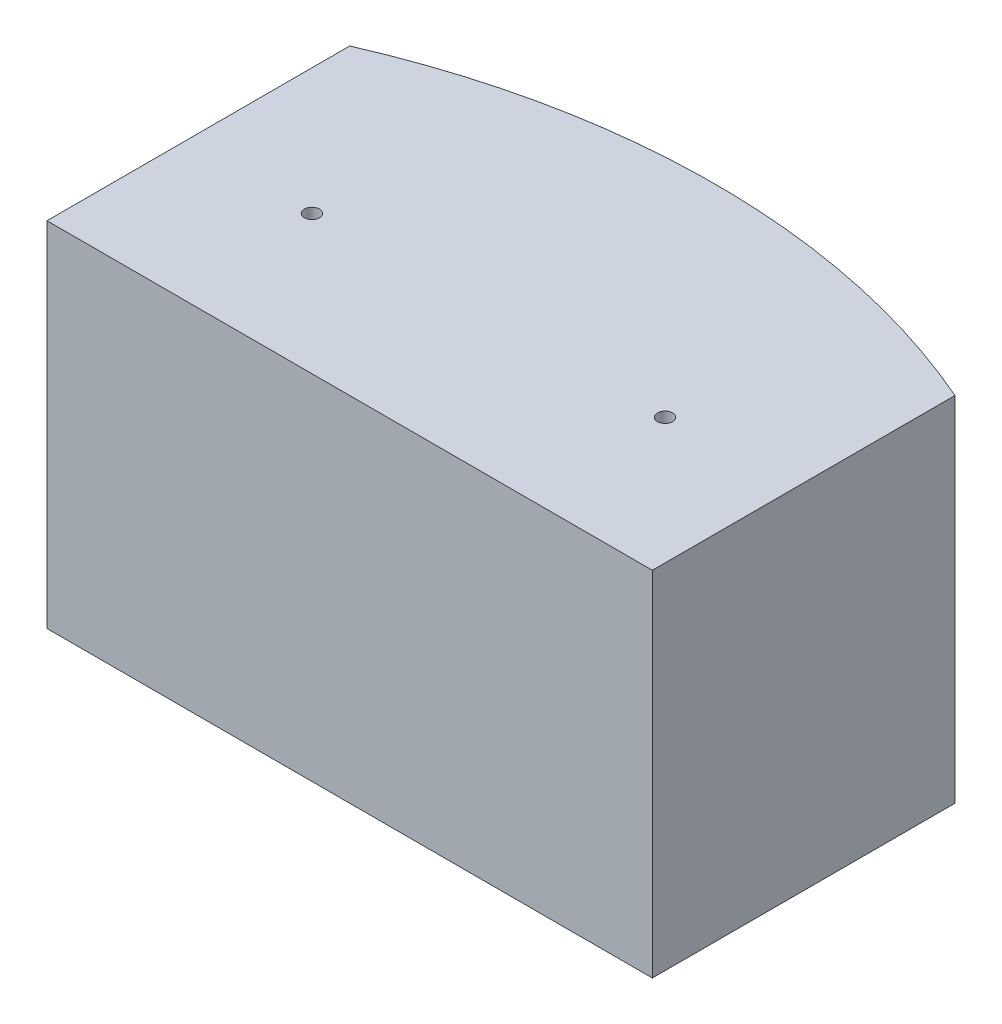
ISO-10303-21;
HEADER;
FILE_DESCRIPTION(('STEP AP214'),'2;1');
FILE_NAME('part.step','',(''),(''),'','','');
FILE_SCHEMA(('AUTOMOTIVE_DESIGN { 1 0 10303 214 1 1 1 1 }'));
ENDSEC;
DATA;
#1=APPLICATION_CONTEXT('core data for automotive mechanical design processes');
#2=APPLICATION_PROTOCOL_DEFINITION('international standard','automotive_design',2000,#1);
#3=PRODUCT_CONTEXT('',#1,'mechanical');
#4=PRODUCT('Part','Part','',(#3));
#5=PRODUCT_RELATED_PRODUCT_CATEGORY('part','',(#4));
#6=PRODUCT_DEFINITION_FORMATION('','',#4);
#7=PRODUCT_DEFINITION_CONTEXT('part definition',#1,'design');
#8=PRODUCT_DEFINITION('design','',#6,#7);
#9=PRODUCT_DEFINITION_SHAPE('','',#8);
#10=(LENGTH_UNIT() NAMED_UNIT(*) SI_UNIT(.MILLI.,.METRE.));
#11=(NAMED_UNIT(*) PLANE_ANGLE_UNIT() SI_UNIT($,.RADIAN.));
#12=(NAMED_UNIT(*) SI_UNIT($,.STERADIAN.) SOLID_ANGLE_UNIT());
#13=UNCERTAINTY_MEASURE_WITH_UNIT(LENGTH_MEASURE(1.E-05),#10,'distance_accuracy_value','');
#14=(GEOMETRIC_REPRESENTATION_CONTEXT(3) GLOBAL_UNCERTAINTY_ASSIGNED_CONTEXT((#13)) GLOBAL_UNIT_ASSIGNED_CONTEXT((#10,
#11,#12)) REPRESENTATION_CONTEXT('',''));
#15=CARTESIAN_POINT('',(0.,0.,0.));
#16=DIRECTION('',(0.,0.,1.));
#17=DIRECTION('',(1.,0.,0.));
#18=AXIS2_PLACEMENT_3D('',#15,#16,#17);
#19=CARTESIAN_POINT('',(-57.,67.,-154.477270848675));
#20=DIRECTION('',(-1.,0.,0.));
#21=DIRECTION('',(0.,0.,1.));
#22=AXIS2_PLACEMENT_3D('',#19,#20,#21);
#23=PLANE('',#22);
#24=DIRECTION('',(0.,0.,1.));
#25=VECTOR('',#24,1.);
#26=CARTESIAN_POINT('',(-57.,36.5,-150.001));
#27=LINE('',#26,#25);
#28=CARTESIAN_POINT('',(-57.,36.5,-138.747972958166));
#29=VERTEX_POINT('',#28);
#30=CARTESIAN_POINT('',(-57.,36.5,-80.4772708486752));
#31=VERTEX_POINT('',#30);
#32=EDGE_CURVE('E147',#29,#31,#27,.T.);
#33=ORIENTED_EDGE('',*,*,#32,.F.);
#34=DIRECTION('',(0.,-1.,0.));
#35=VECTOR('',#34,1.);
#36=CARTESIAN_POINT('',(-57.,70.,-138.747972958166));
#37=LINE('',#36,#35);
#38=CARTESIAN_POINT('',(-57.,67.,-138.747972958166));
#39=VERTEX_POINT('',#38);
#40=EDGE_CURVE('E195',#39,#29,#37,.T.);
#41=ORIENTED_EDGE('',*,*,#40,.F.);
#42=DIRECTION('',(0.,0.,1.));
#43=VECTOR('',#42,1.);
#44=CARTESIAN_POINT('',(-57.,67.,-154.477270848675));
#45=LINE('',#44,#43);
#46=CARTESIAN_POINT('',(-57.,67.,-80.4772708486752));
#47=VERTEX_POINT('',#46);
#48=EDGE_CURVE('E177',#39,#47,#45,.T.);
#49=ORIENTED_EDGE('',*,*,#48,.T.);
#50=DIRECTION('',(0.,1.,0.));
#51=VECTOR('',#50,1.);
#52=CARTESIAN_POINT('',(-57.,3.,-80.4772708486752));
#53=LINE('',#52,#51);
#54=EDGE_CURVE('E138',#31,#47,#53,.T.);
#55=ORIENTED_EDGE('',*,*,#54,.F.);
#56=EDGE_LOOP('',(#33,#41,#49,#55));
#57=FACE_BOUND('',#56,.T.);
#58=ADVANCED_FACE('F37',(#57),#23,.F.);
#59=DIRECTION('',(0.,0.,1.));
#60=VECTOR('',#59,1.);
#61=CARTESIAN_POINT('',(-57.,33.5,-150.001));
#62=LINE('',#61,#60);
#63=CARTESIAN_POINT('',(-57.,33.5,-138.747972958166));
#64=VERTEX_POINT('',#63);
#65=CARTESIAN_POINT('',(-57.,33.5,-80.4772708486752));
#66=VERTEX_POINT('',#65);
#67=EDGE_CURVE('E141',#64,#66,#62,.T.);
#68=ORIENTED_EDGE('',*,*,#67,.T.);
#69=CARTESIAN_POINT('',(-57.,3.,-80.4772708486752));
#70=VERTEX_POINT('',#69);
#71=EDGE_CURVE('E128',#70,#66,#53,.T.);
#72=ORIENTED_EDGE('',*,*,#71,.F.);
#73=DIRECTION('',(0.,0.,1.));
#74=VECTOR('',#73,1.);
#75=CARTESIAN_POINT('',(-57.,3.,-154.477270848675));
#76=LINE('',#75,#74);
#77=CARTESIAN_POINT('',(-57.,3.,-138.747972958166));
#78=VERTEX_POINT('',#77);
#79=EDGE_CURVE('E172',#78,#70,#76,.T.);
#80=ORIENTED_EDGE('',*,*,#79,.F.);
#81=EDGE_CURVE('E143',#64,#78,#37,.T.);
#82=ORIENTED_EDGE('',*,*,#81,.F.);
#83=EDGE_LOOP('',(#68,#72,#80,#82));
#84=FACE_BOUND('',#83,.T.);
#85=ADVANCED_FACE('F142',(#84),#23,.F.);
#86=CARTESIAN_POINT('',(57.,3.,-154.477270848675));
#87=DIRECTION('',(1.,0.,0.));
#88=DIRECTION('',(0.,0.,-1.));
#89=AXIS2_PLACEMENT_3D('',#86,#87,#88);
#90=PLANE('',#89);
#91=DIRECTION('',(0.,0.,1.));
#92=VECTOR('',#91,1.);
#93=CARTESIAN_POINT('',(57.,36.5,-150.001));
#94=LINE('',#93,#92);
#95=CARTESIAN_POINT('',(57.,36.5,-138.747972958166));
#96=VERTEX_POINT('',#95);
#97=CARTESIAN_POINT('',(57.,36.5,-80.4772708486752));
#98=VERTEX_POINT('',#97);
#99=EDGE_CURVE('E154',#96,#98,#94,.T.);
#100=ORIENTED_EDGE('',*,*,#99,.T.);
#101=DIRECTION('',(0.,1.,0.));
#102=VECTOR('',#101,1.);
#103=CARTESIAN_POINT('',(57.,3.,-80.4772708486752));
#104=LINE('',#103,#102);
#105=CARTESIAN_POINT('',(57.,67.,-80.4772708486752));
#106=VERTEX_POINT('',#105);
#107=EDGE_CURVE('E173',#98,#106,#104,.T.);
#108=ORIENTED_EDGE('',*,*,#107,.T.);
#109=DIRECTION('',(0.,0.,1.));
#110=VECTOR('',#109,1.);
#111=CARTESIAN_POINT('',(57.,67.,-154.477270848675));
#112=LINE('',#111,#110);
#113=CARTESIAN_POINT('',(57.,67.,-138.747972958166));
#114=VERTEX_POINT('',#113);
#115=EDGE_CURVE('E181',#114,#106,#112,.T.);
#116=ORIENTED_EDGE('',*,*,#115,.F.);
#117=DIRECTION('',(0.,-1.,0.));
#118=VECTOR('',#117,1.);
#119=CARTESIAN_POINT('',(57.,70.,-138.747972958166));
#120=LINE('',#119,#118);
#121=EDGE_CURVE('E52',#96,#114,#120,.F.);
#122=ORIENTED_EDGE('',*,*,#121,.F.);
#123=EDGE_LOOP('',(#100,#108,#116,#122));
#124=FACE_BOUND('',#123,.T.);
#125=ADVANCED_FACE('F257',(#124),#90,.F.);
#126=DIRECTION('',(0.,0.,1.));
#127=VECTOR('',#126,1.);
#128=CARTESIAN_POINT('',(57.,33.5,-150.001));
#129=LINE('',#128,#127);
#130=CARTESIAN_POINT('',(57.,33.5,-138.747972958166));
#131=VERTEX_POINT('',#130);
#132=CARTESIAN_POINT('',(57.,33.5,-80.4772708486752));
#133=VERTEX_POINT('',#132);
#134=EDGE_CURVE('E60',#131,#133,#129,.T.);
#135=ORIENTED_EDGE('',*,*,#134,.F.);
#136=CARTESIAN_POINT('',(57.,3.,-138.747972958166));
#137=VERTEX_POINT('',#136);
#138=EDGE_CURVE('E190',#137,#131,#120,.F.);
#139=ORIENTED_EDGE('',*,*,#138,.F.);
#140=DIRECTION('',(0.,0.,1.));
#141=VECTOR('',#140,1.);
#142=CARTESIAN_POINT('',(57.,3.,-154.477270848675));
#143=LINE('',#142,#141);
#144=CARTESIAN_POINT('',(57.,3.,-80.4772708486752));
#145=VERTEX_POINT('',#144);
#146=EDGE_CURVE('E184',#137,#145,#143,.T.);
#147=ORIENTED_EDGE('',*,*,#146,.T.);
#148=EDGE_CURVE('E170',#145,#133,#104,.T.);
#149=ORIENTED_EDGE('',*,*,#148,.T.);
#150=EDGE_LOOP('',(#135,#139,#147,#149));
#151=FACE_BOUND('',#150,.T.);
#152=ADVANCED_FACE('F360',(#151),#90,.F.);
#153=CARTESIAN_POINT('',(121.070273918565,3.,-80.4772708486752));
#154=DIRECTION('',(0.,0.,1.));
#155=DIRECTION('',(1.,0.,0.));
#156=AXIS2_PLACEMENT_3D('',#153,#154,#155);
#157=PLANE('',#156);
#158=DIRECTION('',(1.,0.,0.));
#159=VECTOR('',#158,1.);
#160=CARTESIAN_POINT('',(57.,36.5,-80.4772708486752));
#161=LINE('',#160,#159);
#162=EDGE_CURVE('E150',#31,#98,#161,.T.);
#163=ORIENTED_EDGE('',*,*,#162,.F.);
#164=ORIENTED_EDGE('',*,*,#54,.T.);
#165=DIRECTION('',(-1.,0.,0.));
#166=VECTOR('',#165,1.);
#167=CARTESIAN_POINT('',(121.070273918565,67.,-80.4772708486752));
#168=LINE('',#167,#166);
#169=EDGE_CURVE('E137',#106,#47,#168,.T.);
#170=ORIENTED_EDGE('',*,*,#169,.F.);
#171=ORIENTED_EDGE('',*,*,#107,.F.);
#172=EDGE_LOOP('',(#163,#164,#170,#171));
#173=FACE_BOUND('',#172,.T.);
#174=ADVANCED_FACE('F369',(#173),#157,.F.);
#175=DIRECTION('',(-1.,0.,0.));
#176=VECTOR('',#175,1.);
#177=CARTESIAN_POINT('',(57.,33.5,-80.4772708486752));
#178=LINE('',#177,#176);
#179=EDGE_CURVE('E133',#133,#66,#178,.T.);
#180=ORIENTED_EDGE('',*,*,#179,.F.);
#181=ORIENTED_EDGE('',*,*,#148,.F.);
#182=DIRECTION('',(-1.,0.,0.));
#183=VECTOR('',#182,1.);
#184=CARTESIAN_POINT('',(121.070273918565,3.,-80.4772708486752));
#185=LINE('',#184,#183);
#186=EDGE_CURVE('E134',#145,#70,#185,.T.);
#187=ORIENTED_EDGE('',*,*,#186,.T.);
#188=ORIENTED_EDGE('',*,*,#71,.T.);
#189=EDGE_LOOP('',(#180,#181,#187,#188));
#190=FACE_BOUND('',#189,.T.);
#191=ADVANCED_FACE('F130',(#190),#157,.F.);
#192=CARTESIAN_POINT('',(57.,67.,-154.477270848675));
#193=DIRECTION('',(0.,1.,0.));
#194=DIRECTION('',(0.,0.,1.));
#195=AXIS2_PLACEMENT_3D('',#192,#193,#194);
#196=PLANE('',#195);
#197=CARTESIAN_POINT('',(-35.,67.,-104.997270848675));
#198=DIRECTION('',(0.,1.,0.));
#199=DIRECTION('',(0.,0.,1.));
#200=AXIS2_PLACEMENT_3D('',#197,#198,#199);
#201=CIRCLE('',#200,1.5);
#202=CARTESIAN_POINT('',(-35.,67.,-103.497270848675));
#203=VERTEX_POINT('',#202);
#204=EDGE_CURVE('E151',#203,#203,#201,.F.);
#205=ORIENTED_EDGE('',*,*,#204,.F.);
#206=EDGE_LOOP('',(#205));
#207=FACE_BOUND('',#206,.T.);
#208=CARTESIAN_POINT('',(35.,67.,-104.997270848675));
#209=DIRECTION('',(0.,1.,0.));
#210=DIRECTION('',(0.,0.,1.));
#211=AXIS2_PLACEMENT_3D('',#208,#209,#210);
#212=CIRCLE('',#211,1.5);
#213=CARTESIAN_POINT('',(35.,67.,-103.497270848675));
#214=VERTEX_POINT('',#213);
#215=EDGE_CURVE('E454',#214,#214,#212,.F.);
#216=ORIENTED_EDGE('',*,*,#215,.F.);
#217=EDGE_LOOP('',(#216));
#218=FACE_BOUND('',#217,.T.);
#219=ORIENTED_EDGE('',*,*,#169,.T.);
#220=ORIENTED_EDGE('',*,*,#48,.F.);
#221=CARTESIAN_POINT('',(0.,67.,0.));
#222=DIRECTION('',(0.,1.,0.));
#223=DIRECTION('',(0.,0.,1.));
#224=AXIS2_PLACEMENT_3D('',#221,#222,#223);
#225=CIRCLE('',#224,150.);
#226=EDGE_CURVE('E192',#114,#39,#225,.T.);
#227=ORIENTED_EDGE('',*,*,#226,.F.);
#228=ORIENTED_EDGE('',*,*,#115,.T.);
#229=EDGE_LOOP('',(#219,#220,#227,#228));
#230=FACE_BOUND('',#229,.T.);
#231=ADVANCED_FACE('F386',(#207,#218,#230),#196,.F.);
#232=CARTESIAN_POINT('',(-57.,3.,-154.477270848675));
#233=DIRECTION('',(0.,-1.,0.));
#234=DIRECTION('',(0.,0.,-1.));
#235=AXIS2_PLACEMENT_3D('',#232,#233,#234);
#236=PLANE('',#235);
#237=ORIENTED_EDGE('',*,*,#186,.F.);
#238=ORIENTED_EDGE('',*,*,#146,.F.);
#239=CARTESIAN_POINT('',(0.,3.,0.));
#240=DIRECTION('',(0.,-1.,0.));
#241=DIRECTION('',(0.,0.,-1.));
#242=AXIS2_PLACEMENT_3D('',#239,#240,#241);
#243=CIRCLE('',#242,150.);
#244=EDGE_CURVE('E180',#78,#137,#243,.T.);
#245=ORIENTED_EDGE('',*,*,#244,.F.);
#246=ORIENTED_EDGE('',*,*,#79,.T.);
#247=EDGE_LOOP('',(#237,#238,#245,#246));
#248=FACE_BOUND('',#247,.T.);
#249=ADVANCED_FACE('F249',(#248),#236,.F.);
#250=CARTESIAN_POINT('',(0.,70.,0.));
#251=DIRECTION('',(0.,-1.,0.));
#252=DIRECTION('',(0.,0.,-1.));
#253=AXIS2_PLACEMENT_3D('',#250,#251,#252);
#254=CYLINDRICAL_SURFACE('',#253,150.);
#255=CARTESIAN_POINT('',(0.,33.5,0.));
#256=DIRECTION('',(0.,1.,0.));
#257=DIRECTION('',(0.,0.,1.));
#258=AXIS2_PLACEMENT_3D('',#255,#256,#257);
#259=CIRCLE('',#258,150.);
#260=EDGE_CURVE('E160',#64,#131,#259,.F.);
#261=ORIENTED_EDGE('',*,*,#260,.F.);
#262=ORIENTED_EDGE('',*,*,#81,.T.);
#263=ORIENTED_EDGE('',*,*,#244,.T.);
#264=ORIENTED_EDGE('',*,*,#138,.T.);
#265=EDGE_LOOP('',(#261,#262,#263,#264));
#266=FACE_BOUND('',#265,.T.);
#267=ORIENTED_EDGE('',*,*,#226,.T.);
#268=ORIENTED_EDGE('',*,*,#40,.T.);
#269=CARTESIAN_POINT('',(0.,36.5,0.));
#270=DIRECTION('',(0.,-1.,0.));
#271=DIRECTION('',(0.,0.,-1.));
#272=AXIS2_PLACEMENT_3D('',#269,#270,#271);
#273=CIRCLE('',#272,150.);
#274=EDGE_CURVE('E167',#96,#29,#273,.F.);
#275=ORIENTED_EDGE('',*,*,#274,.F.);
#276=ORIENTED_EDGE('',*,*,#121,.T.);
#277=EDGE_LOOP('',(#267,#268,#275,#276));
#278=FACE_BOUND('',#277,.T.);
#279=CARTESIAN_POINT('',(0.,0.,0.));
#280=DIRECTION('',(0.,1.,0.));
#281=DIRECTION('',(0.,0.,1.));
#282=AXIS2_PLACEMENT_3D('',#279,#280,#281);
#283=CIRCLE('',#282,150.);
#284=CARTESIAN_POINT('',(60.,0.,-137.477270848675));
#285=VERTEX_POINT('',#284);
#286=CARTESIAN_POINT('',(-60.,0.,-137.477270848675));
#287=VERTEX_POINT('',#286);
#288=EDGE_CURVE('E198',#285,#287,#283,.T.);
#289=ORIENTED_EDGE('',*,*,#288,.T.);
#290=DIRECTION('',(0.,-1.,0.));
#291=VECTOR('',#290,1.);
#292=CARTESIAN_POINT('',(-60.,70.,-137.477270848675));
#293=LINE('',#292,#291);
#294=CARTESIAN_POINT('',(-60.,70.,-137.477270848675));
#295=VERTEX_POINT('',#294);
#296=EDGE_CURVE('E11',#295,#287,#293,.T.);
#297=ORIENTED_EDGE('',*,*,#296,.F.);
#298=CARTESIAN_POINT('',(0.,70.,0.));
#299=DIRECTION('',(0.,1.,0.));
#300=DIRECTION('',(0.,0.,1.));
#301=AXIS2_PLACEMENT_3D('',#298,#299,#300);
#302=CIRCLE('',#301,150.);
#303=CARTESIAN_POINT('',(60.,70.,-137.477270848675));
#304=VERTEX_POINT('',#303);
#305=EDGE_CURVE('E199',#304,#295,#302,.T.);
#306=ORIENTED_EDGE('',*,*,#305,.F.);
#307=DIRECTION('',(0.,-1.,0.));
#308=VECTOR('',#307,1.);
#309=CARTESIAN_POINT('',(60.,70.,-137.477270848675));
#310=LINE('',#309,#308);
#311=EDGE_CURVE('E209',#304,#285,#310,.T.);
#312=ORIENTED_EDGE('',*,*,#311,.T.);
#313=EDGE_LOOP('',(#289,#297,#306,#312));
#314=FACE_BOUND('',#313,.T.);
#315=ADVANCED_FACE('F39',(#266,#278,#314),#254,.T.);
#316=CARTESIAN_POINT('',(-60.,70.,-137.477270848675));
#317=DIRECTION('',(1.,0.,0.));
#318=DIRECTION('',(0.,0.,-1.));
#319=AXIS2_PLACEMENT_3D('',#316,#317,#318);
#320=PLANE('',#319);
#321=DIRECTION('',(0.,0.,1.));
#322=VECTOR('',#321,1.);
#323=CARTESIAN_POINT('',(-60.,0.,-137.477270848675));
#324=LINE('',#323,#322);
#325=CARTESIAN_POINT('',(-60.,0.,-77.4772708486752));
#326=VERTEX_POINT('',#325);
#327=EDGE_CURVE('E212',#287,#326,#324,.T.);
#328=ORIENTED_EDGE('',*,*,#327,.T.);
#329=DIRECTION('',(0.,-1.,0.));
#330=VECTOR('',#329,1.);
#331=CARTESIAN_POINT('',(-60.,70.,-77.4772708486752));
#332=LINE('',#331,#330);
#333=CARTESIAN_POINT('',(-60.,70.,-77.4772708486752));
#334=VERTEX_POINT('',#333);
#335=EDGE_CURVE('E45',#334,#326,#332,.T.);
#336=ORIENTED_EDGE('',*,*,#335,.F.);
#337=DIRECTION('',(0.,0.,1.));
#338=VECTOR('',#337,1.);
#339=CARTESIAN_POINT('',(-60.,70.,-137.477270848675));
#340=LINE('',#339,#338);
#341=EDGE_CURVE('E202',#295,#334,#340,.T.);
#342=ORIENTED_EDGE('',*,*,#341,.F.);
#343=ORIENTED_EDGE('',*,*,#296,.T.);
#344=EDGE_LOOP('',(#328,#336,#342,#343));
#345=FACE_BOUND('',#344,.T.);
#346=ADVANCED_FACE('F242',(#345),#320,.F.);
#347=CARTESIAN_POINT('',(-60.,70.,-77.4772708486752));
#348=DIRECTION('',(0.,0.,-1.));
#349=DIRECTION('',(-1.,0.,0.));
#350=AXIS2_PLACEMENT_3D('',#347,#348,#349);
#351=PLANE('',#350);
#352=DIRECTION('',(1.,0.,0.));
#353=VECTOR('',#352,1.);
#354=CARTESIAN_POINT('',(-60.,0.,-77.4772708486752));
#355=LINE('',#354,#353);
#356=CARTESIAN_POINT('',(60.,0.,-77.4772708486752));
#357=VERTEX_POINT('',#356);
#358=EDGE_CURVE('E214',#326,#357,#355,.T.);
#359=ORIENTED_EDGE('',*,*,#358,.T.);
#360=DIRECTION('',(0.,-1.,0.));
#361=VECTOR('',#360,1.);
#362=CARTESIAN_POINT('',(60.,70.,-77.4772708486752));
#363=LINE('',#362,#361);
#364=CARTESIAN_POINT('',(60.,70.,-77.4772708486752));
#365=VERTEX_POINT('',#364);
#366=EDGE_CURVE('E219',#365,#357,#363,.T.);
#367=ORIENTED_EDGE('',*,*,#366,.F.);
#368=DIRECTION('',(1.,0.,0.));
#369=VECTOR('',#368,1.);
#370=CARTESIAN_POINT('',(-60.,70.,-77.4772708486752));
#371=LINE('',#370,#369);
#372=EDGE_CURVE('E205',#334,#365,#371,.T.);
#373=ORIENTED_EDGE('',*,*,#372,.F.);
#374=ORIENTED_EDGE('',*,*,#335,.T.);
#375=EDGE_LOOP('',(#359,#367,#373,#374));
#376=FACE_BOUND('',#375,.T.);
#377=ADVANCED_FACE('F226',(#376),#351,.F.);
#378=CARTESIAN_POINT('',(60.,70.,-137.477270848675));
#379=DIRECTION('',(-1.,0.,0.));
#380=DIRECTION('',(0.,0.,1.));
#381=AXIS2_PLACEMENT_3D('',#378,#379,#380);
#382=PLANE('',#381);
#383=DIRECTION('',(0.,0.,-1.));
#384=VECTOR('',#383,1.);
#385=CARTESIAN_POINT('',(60.,0.,-137.477270848675));
#386=LINE('',#385,#384);
#387=EDGE_CURVE('E203',#357,#285,#386,.T.);
#388=ORIENTED_EDGE('',*,*,#387,.T.);
#389=ORIENTED_EDGE('',*,*,#311,.F.);
#390=DIRECTION('',(0.,0.,-1.));
#391=VECTOR('',#390,1.);
#392=CARTESIAN_POINT('',(60.,70.,-137.477270848675));
#393=LINE('',#392,#391);
#394=EDGE_CURVE('E207',#365,#304,#393,.T.);
#395=ORIENTED_EDGE('',*,*,#394,.F.);
#396=ORIENTED_EDGE('',*,*,#366,.T.);
#397=EDGE_LOOP('',(#388,#389,#395,#396));
#398=FACE_BOUND('',#397,.T.);
#399=ADVANCED_FACE('F235',(#398),#382,.F.);
#400=CARTESIAN_POINT('',(0.,70.,0.));
#401=DIRECTION('',(0.,1.,0.));
#402=DIRECTION('',(0.,0.,1.));
#403=AXIS2_PLACEMENT_3D('',#400,#401,#402);
#404=PLANE('',#403);
#405=CARTESIAN_POINT('',(-35.,70.,-104.997270848675));
#406=DIRECTION('',(0.,1.,0.));
#407=DIRECTION('',(0.,0.,1.));
#408=AXIS2_PLACEMENT_3D('',#405,#406,#407);
#409=CIRCLE('',#408,1.5);
#410=CARTESIAN_POINT('',(-35.,70.,-103.497270848675));
#411=VERTEX_POINT('',#410);
#412=EDGE_CURVE('E157',#411,#411,#409,.T.);
#413=ORIENTED_EDGE('',*,*,#412,.F.);
#414=EDGE_LOOP('',(#413));
#415=FACE_BOUND('',#414,.T.);
#416=CARTESIAN_POINT('',(35.,70.,-104.997270848675));
#417=DIRECTION('',(0.,1.,0.));
#418=DIRECTION('',(0.,0.,1.));
#419=AXIS2_PLACEMENT_3D('',#416,#417,#418);
#420=CIRCLE('',#419,1.5);
#421=CARTESIAN_POINT('',(35.,70.,-103.497270848675));
#422=VERTEX_POINT('',#421);
#423=EDGE_CURVE('E455',#422,#422,#420,.T.);
#424=ORIENTED_EDGE('',*,*,#423,.F.);
#425=EDGE_LOOP('',(#424));
#426=FACE_BOUND('',#425,.T.);
#427=ORIENTED_EDGE('',*,*,#305,.T.);
#428=ORIENTED_EDGE('',*,*,#341,.T.);
#429=ORIENTED_EDGE('',*,*,#372,.T.);
#430=ORIENTED_EDGE('',*,*,#394,.T.);
#431=EDGE_LOOP('',(#427,#428,#429,#430));
#432=FACE_BOUND('',#431,.T.);
#433=ADVANCED_FACE('F241',(#415,#426,#432),#404,.T.);
#434=CARTESIAN_POINT('',(0.,0.,0.));
#435=DIRECTION('',(0.,1.,0.));
#436=DIRECTION('',(0.,0.,1.));
#437=AXIS2_PLACEMENT_3D('',#434,#435,#436);
#438=PLANE('',#437);
#439=ORIENTED_EDGE('',*,*,#288,.F.);
#440=ORIENTED_EDGE('',*,*,#387,.F.);
#441=ORIENTED_EDGE('',*,*,#358,.F.);
#442=ORIENTED_EDGE('',*,*,#327,.F.);
#443=EDGE_LOOP('',(#439,#440,#441,#442));
#444=FACE_BOUND('',#443,.T.);
#445=ADVANCED_FACE('F232',(#444),#438,.F.);
#446=CARTESIAN_POINT('',(57.,36.5,-150.001));
#447=DIRECTION('',(0.,-1.,0.));
#448=DIRECTION('',(0.,0.,-1.));
#449=AXIS2_PLACEMENT_3D('',#446,#447,#448);
#450=PLANE('',#449);
#451=ORIENTED_EDGE('',*,*,#99,.F.);
#452=ORIENTED_EDGE('',*,*,#274,.T.);
#453=ORIENTED_EDGE('',*,*,#32,.T.);
#454=ORIENTED_EDGE('',*,*,#162,.T.);
#455=EDGE_LOOP('',(#451,#452,#453,#454));
#456=FACE_BOUND('',#455,.T.);
#457=ADVANCED_FACE('F266',(#456),#450,.F.);
#458=CARTESIAN_POINT('',(57.,33.5,-150.001));
#459=DIRECTION('',(0.,1.,0.));
#460=DIRECTION('',(0.,0.,1.));
#461=AXIS2_PLACEMENT_3D('',#458,#459,#460);
#462=PLANE('',#461);
#463=ORIENTED_EDGE('',*,*,#67,.F.);
#464=ORIENTED_EDGE('',*,*,#260,.T.);
#465=ORIENTED_EDGE('',*,*,#134,.T.);
#466=ORIENTED_EDGE('',*,*,#179,.T.);
#467=EDGE_LOOP('',(#463,#464,#465,#466));
#468=FACE_BOUND('',#467,.T.);
#469=ADVANCED_FACE('F149',(#468),#462,.F.);
#470=CARTESIAN_POINT('',(35.,62.7573593128807,-104.997270848675));
#471=DIRECTION('',(0.,1.,0.));
#472=DIRECTION('',(0.,0.,1.));
#473=AXIS2_PLACEMENT_3D('',#470,#471,#472);
#474=CYLINDRICAL_SURFACE('',#473,1.5);
#475=ORIENTED_EDGE('',*,*,#215,.T.);
#476=EDGE_LOOP('',(#475));
#477=FACE_BOUND('',#476,.T.);
#478=ORIENTED_EDGE('',*,*,#423,.T.);
#479=EDGE_LOOP('',(#478));
#480=FACE_BOUND('',#479,.T.);
#481=ADVANCED_FACE('F297',(#477,#480),#474,.F.);
#482=CARTESIAN_POINT('',(-35.,62.7573593128807,-104.997270848675));
#483=DIRECTION('',(0.,1.,0.));
#484=DIRECTION('',(0.,0.,1.));
#485=AXIS2_PLACEMENT_3D('',#482,#483,#484);
#486=CYLINDRICAL_SURFACE('',#485,1.5);
#487=ORIENTED_EDGE('',*,*,#204,.T.);
#488=EDGE_LOOP('',(#487));
#489=FACE_BOUND('',#488,.T.);
#490=ORIENTED_EDGE('',*,*,#412,.T.);
#491=EDGE_LOOP('',(#490));
#492=FACE_BOUND('',#491,.T.);
#493=ADVANCED_FACE('F303',(#489,#492),#486,.F.);
#494=CLOSED_SHELL('',(#58,#85,#125,#152,#174,#191,#231,#249,#315,#346,#377,#399,#433,#445,#457,
#469,#481,#493));
#495=MANIFOLD_SOLID_BREP('B2',#494);
#496=ADVANCED_BREP_SHAPE_REPRESENTATION('',(#18,#495),#14);
#497=SHAPE_DEFINITION_REPRESENTATION(#9,#496);
ENDSEC;
END-ISO-10303-21;
